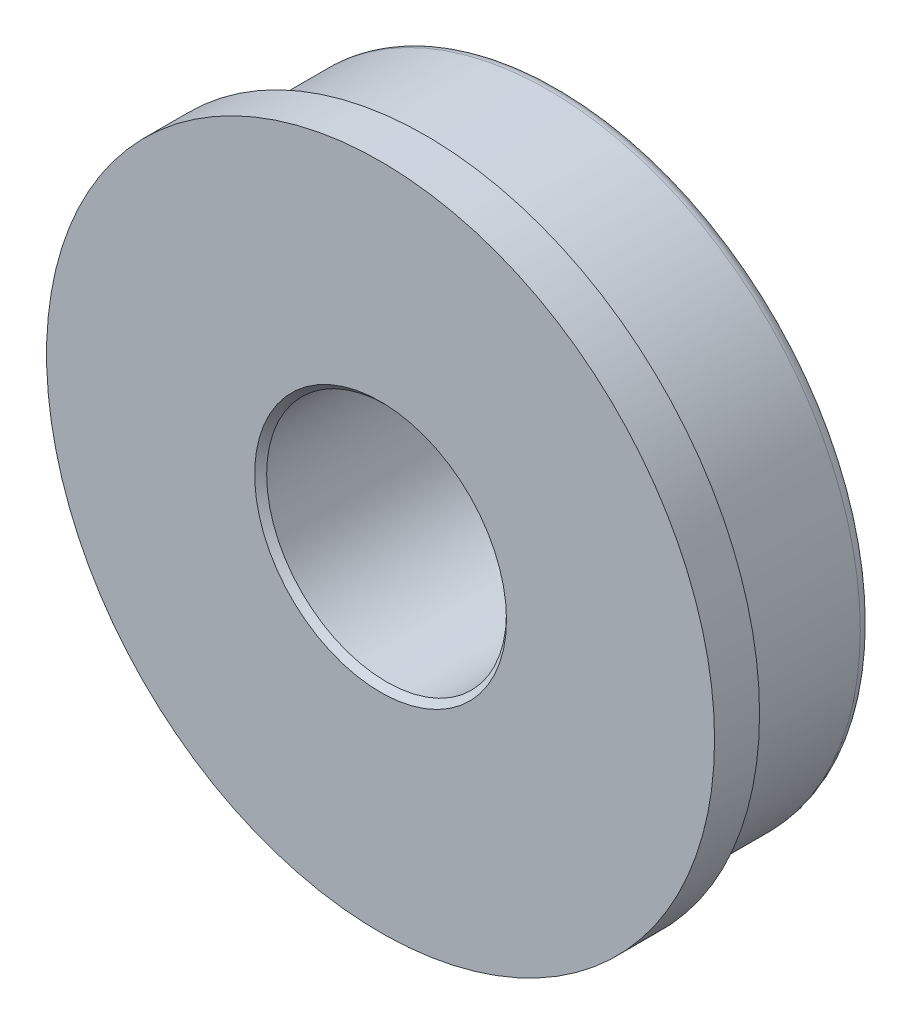
ISO-10303-21;
HEADER;
FILE_DESCRIPTION(('STEP AP214'),'2;1');
FILE_NAME('part.step','',(''),(''),'','','');
FILE_SCHEMA(('AUTOMOTIVE_DESIGN { 1 0 10303 214 1 1 1 1 }'));
ENDSEC;
DATA;
#1=APPLICATION_CONTEXT('core data for automotive mechanical design processes');
#2=APPLICATION_PROTOCOL_DEFINITION('international standard','automotive_design',2000,#1);
#3=PRODUCT_CONTEXT('',#1,'mechanical');
#4=PRODUCT('Part','Part','',(#3));
#5=PRODUCT_RELATED_PRODUCT_CATEGORY('part','',(#4));
#6=PRODUCT_DEFINITION_FORMATION('','',#4);
#7=PRODUCT_DEFINITION_CONTEXT('part definition',#1,'design');
#8=PRODUCT_DEFINITION('design','',#6,#7);
#9=PRODUCT_DEFINITION_SHAPE('','',#8);
#10=(LENGTH_UNIT() NAMED_UNIT(*) SI_UNIT(.MILLI.,.METRE.));
#11=(NAMED_UNIT(*) PLANE_ANGLE_UNIT() SI_UNIT($,.RADIAN.));
#12=(NAMED_UNIT(*) SI_UNIT($,.STERADIAN.) SOLID_ANGLE_UNIT());
#13=UNCERTAINTY_MEASURE_WITH_UNIT(LENGTH_MEASURE(1.E-05),#10,'distance_accuracy_value','');
#14=(GEOMETRIC_REPRESENTATION_CONTEXT(3) GLOBAL_UNCERTAINTY_ASSIGNED_CONTEXT((#13)) GLOBAL_UNIT_ASSIGNED_CONTEXT((#10,
#11,#12)) REPRESENTATION_CONTEXT('',''));
#15=CARTESIAN_POINT('',(0.,0.,0.));
#16=DIRECTION('',(0.,0.,1.));
#17=DIRECTION('',(1.,0.,0.));
#18=AXIS2_PLACEMENT_3D('',#15,#16,#17);
#19=CARTESIAN_POINT('',(0.,0.,7.5));
#20=DIRECTION('',(0.,0.,-1.));
#21=DIRECTION('',(-1.,0.,0.));
#22=AXIS2_PLACEMENT_3D('',#19,#20,#21);
#23=CYLINDRICAL_SURFACE('',#22,26.);
#24=CARTESIAN_POINT('',(0.,0.,-6.5));
#25=DIRECTION('',(0.,0.,1.));
#26=DIRECTION('',(1.,0.,0.));
#27=AXIS2_PLACEMENT_3D('',#24,#25,#26);
#28=CIRCLE('',#27,26.);
#29=CARTESIAN_POINT('',(26.,0.,-6.5));
#30=VERTEX_POINT('',#29);
#31=EDGE_CURVE('E40',#30,#30,#28,.T.);
#32=ORIENTED_EDGE('',*,*,#31,.T.);
#33=EDGE_LOOP('',(#32));
#34=FACE_BOUND('',#33,.T.);
#35=CARTESIAN_POINT('',(0.,0.,3.75));
#36=DIRECTION('',(0.,0.,1.));
#37=DIRECTION('',(1.,0.,0.));
#38=AXIS2_PLACEMENT_3D('',#35,#36,#37);
#39=CIRCLE('',#38,26.);
#40=CARTESIAN_POINT('',(26.,0.,3.75));
#41=VERTEX_POINT('',#40);
#42=EDGE_CURVE('E59',#41,#41,#39,.T.);
#43=ORIENTED_EDGE('',*,*,#42,.F.);
#44=EDGE_LOOP('',(#43));
#45=FACE_BOUND('',#44,.T.);
#46=ADVANCED_FACE('F33',(#34,#45),#23,.T.);
#47=CARTESIAN_POINT('',(0.,0.,7.5));
#48=DIRECTION('',(0.,0.,1.));
#49=DIRECTION('',(1.,0.,0.));
#50=AXIS2_PLACEMENT_3D('',#47,#48,#49);
#51=PLANE('',#50);
#52=CARTESIAN_POINT('',(0.,0.,7.5));
#53=DIRECTION('',(0.,0.,1.));
#54=DIRECTION('',(1.,0.,0.));
#55=AXIS2_PLACEMENT_3D('',#52,#53,#54);
#56=CIRCLE('',#55,10.5);
#57=CARTESIAN_POINT('',(10.5,0.,7.5));
#58=VERTEX_POINT('',#57);
#59=EDGE_CURVE('E44',#58,#58,#56,.F.);
#60=ORIENTED_EDGE('',*,*,#59,.T.);
#61=EDGE_LOOP('',(#60));
#62=FACE_BOUND('',#61,.T.);
#63=CARTESIAN_POINT('',(0.,0.,7.5));
#64=DIRECTION('',(0.,0.,1.));
#65=DIRECTION('',(1.,0.,0.));
#66=AXIS2_PLACEMENT_3D('',#63,#64,#65);
#67=CIRCLE('',#66,27.85);
#68=CARTESIAN_POINT('',(27.85,0.,7.5));
#69=VERTEX_POINT('',#68);
#70=EDGE_CURVE('E63',#69,#69,#67,.T.);
#71=ORIENTED_EDGE('',*,*,#70,.T.);
#72=EDGE_LOOP('',(#71));
#73=FACE_BOUND('',#72,.T.);
#74=ADVANCED_FACE('F87',(#62,#73),#51,.T.);
#75=CARTESIAN_POINT('',(0.,0.,-7.5));
#76=DIRECTION('',(0.,0.,1.));
#77=DIRECTION('',(1.,0.,0.));
#78=AXIS2_PLACEMENT_3D('',#75,#76,#77);
#79=PLANE('',#78);
#80=CARTESIAN_POINT('',(0.,0.,-7.5));
#81=DIRECTION('',(0.,0.,1.));
#82=DIRECTION('',(1.,0.,0.));
#83=AXIS2_PLACEMENT_3D('',#80,#81,#82);
#84=CIRCLE('',#83,25.);
#85=CARTESIAN_POINT('',(25.,0.,-7.5));
#86=VERTEX_POINT('',#85);
#87=EDGE_CURVE('E10',#86,#86,#84,.F.);
#88=ORIENTED_EDGE('',*,*,#87,.T.);
#89=EDGE_LOOP('',(#88));
#90=FACE_BOUND('',#89,.T.);
#91=CARTESIAN_POINT('',(0.,0.,-7.5));
#92=DIRECTION('',(0.,0.,1.));
#93=DIRECTION('',(1.,0.,0.));
#94=AXIS2_PLACEMENT_3D('',#91,#92,#93);
#95=CIRCLE('',#94,10.5);
#96=CARTESIAN_POINT('',(10.5,0.,-7.5));
#97=VERTEX_POINT('',#96);
#98=EDGE_CURVE('E56',#97,#97,#95,.T.);
#99=ORIENTED_EDGE('',*,*,#98,.T.);
#100=EDGE_LOOP('',(#99));
#101=FACE_BOUND('',#100,.T.);
#102=ADVANCED_FACE('F92',(#90,#101),#79,.F.);
#103=CARTESIAN_POINT('',(0.,0.,7.5));
#104=DIRECTION('',(0.,0.,-1.));
#105=DIRECTION('',(-1.,0.,0.));
#106=AXIS2_PLACEMENT_3D('',#103,#104,#105);
#107=CYLINDRICAL_SURFACE('',#106,10.);
#108=CARTESIAN_POINT('',(0.,0.,-7.));
#109=DIRECTION('',(0.,0.,1.));
#110=DIRECTION('',(1.,0.,0.));
#111=AXIS2_PLACEMENT_3D('',#108,#109,#110);
#112=CIRCLE('',#111,10.);
#113=CARTESIAN_POINT('',(10.,0.,-7.));
#114=VERTEX_POINT('',#113);
#115=EDGE_CURVE('E48',#114,#114,#112,.F.);
#116=ORIENTED_EDGE('',*,*,#115,.T.);
#117=EDGE_LOOP('',(#116));
#118=FACE_BOUND('',#117,.T.);
#119=CARTESIAN_POINT('',(0.,0.,6.99999999999999));
#120=DIRECTION('',(0.,0.,1.));
#121=DIRECTION('',(1.,0.,0.));
#122=AXIS2_PLACEMENT_3D('',#119,#120,#121);
#123=CIRCLE('',#122,10.);
#124=CARTESIAN_POINT('',(10.,0.,6.99999999999999));
#125=VERTEX_POINT('',#124);
#126=EDGE_CURVE('E53',#125,#125,#123,.T.);
#127=ORIENTED_EDGE('',*,*,#126,.T.);
#128=EDGE_LOOP('',(#127));
#129=FACE_BOUND('',#128,.T.);
#130=ADVANCED_FACE('F84',(#118,#129),#107,.F.);
#131=CARTESIAN_POINT('',(0.,0.,3.75));
#132=DIRECTION('',(0.,0.,1.));
#133=DIRECTION('',(1.,0.,0.));
#134=AXIS2_PLACEMENT_3D('',#131,#132,#133);
#135=CYLINDRICAL_SURFACE('',#134,27.85);
#136=CARTESIAN_POINT('',(0.,0.,3.75));
#137=DIRECTION('',(0.,0.,1.));
#138=DIRECTION('',(1.,0.,0.));
#139=AXIS2_PLACEMENT_3D('',#136,#137,#138);
#140=CIRCLE('',#139,27.85);
#141=CARTESIAN_POINT('',(27.85,0.,3.75));
#142=VERTEX_POINT('',#141);
#143=EDGE_CURVE('E62',#142,#142,#140,.T.);
#144=ORIENTED_EDGE('',*,*,#143,.T.);
#145=EDGE_LOOP('',(#144));
#146=FACE_BOUND('',#145,.T.);
#147=ORIENTED_EDGE('',*,*,#70,.F.);
#148=EDGE_LOOP('',(#147));
#149=FACE_BOUND('',#148,.T.);
#150=ADVANCED_FACE('F69',(#146,#149),#135,.T.);
#151=CARTESIAN_POINT('',(0.,0.,3.75));
#152=DIRECTION('',(0.,0.,1.));
#153=DIRECTION('',(1.,0.,0.));
#154=AXIS2_PLACEMENT_3D('',#151,#152,#153);
#155=PLANE('',#154);
#156=ORIENTED_EDGE('',*,*,#42,.T.);
#157=EDGE_LOOP('',(#156));
#158=FACE_BOUND('',#157,.T.);
#159=ORIENTED_EDGE('',*,*,#143,.F.);
#160=EDGE_LOOP('',(#159));
#161=FACE_BOUND('',#160,.T.);
#162=ADVANCED_FACE('F72',(#158,#161),#155,.F.);
#163=CARTESIAN_POINT('',(0.,0.,-7.5));
#164=DIRECTION('',(0.,0.,-1.));
#165=DIRECTION('',(-1.,0.,0.));
#166=AXIS2_PLACEMENT_3D('',#163,#164,#165);
#167=CONICAL_SURFACE('',#166,10.5,0.785398163397448);
#168=ORIENTED_EDGE('',*,*,#115,.F.);
#169=EDGE_LOOP('',(#168));
#170=FACE_BOUND('',#169,.T.);
#171=ORIENTED_EDGE('',*,*,#98,.F.);
#172=EDGE_LOOP('',(#171));
#173=FACE_BOUND('',#172,.T.);
#174=ADVANCED_FACE('F74',(#170,#173),#167,.F.);
#175=CARTESIAN_POINT('',(0.,0.,6.99999999999999));
#176=DIRECTION('',(0.,0.,1.));
#177=DIRECTION('',(1.,0.,0.));
#178=AXIS2_PLACEMENT_3D('',#175,#176,#177);
#179=CONICAL_SURFACE('',#178,10.,0.785398163397455);
#180=ORIENTED_EDGE('',*,*,#59,.F.);
#181=EDGE_LOOP('',(#180));
#182=FACE_BOUND('',#181,.T.);
#183=ORIENTED_EDGE('',*,*,#126,.F.);
#184=EDGE_LOOP('',(#183));
#185=FACE_BOUND('',#184,.T.);
#186=ADVANCED_FACE('F81',(#182,#185),#179,.F.);
#187=CARTESIAN_POINT('',(0.,0.,-6.5));
#188=DIRECTION('',(0.,0.,1.));
#189=DIRECTION('',(1.,0.,0.));
#190=AXIS2_PLACEMENT_3D('',#187,#188,#189);
#191=TOROIDAL_SURFACE('',#190,25.,1.);
#192=ORIENTED_EDGE('',*,*,#87,.F.);
#193=EDGE_LOOP('',(#192));
#194=FACE_BOUND('',#193,.T.);
#195=ORIENTED_EDGE('',*,*,#31,.F.);
#196=EDGE_LOOP('',(#195));
#197=FACE_BOUND('',#196,.T.);
#198=ADVANCED_FACE('F35',(#194,#197),#191,.T.);
#199=CLOSED_SHELL('',(#46,#74,#102,#130,#150,#162,#174,#186,#198));
#200=MANIFOLD_SOLID_BREP('B2',#199);
#201=ADVANCED_BREP_SHAPE_REPRESENTATION('',(#18,#200),#14);
#202=SHAPE_DEFINITION_REPRESENTATION(#9,#201);
ENDSEC;
END-ISO-10303-21;
